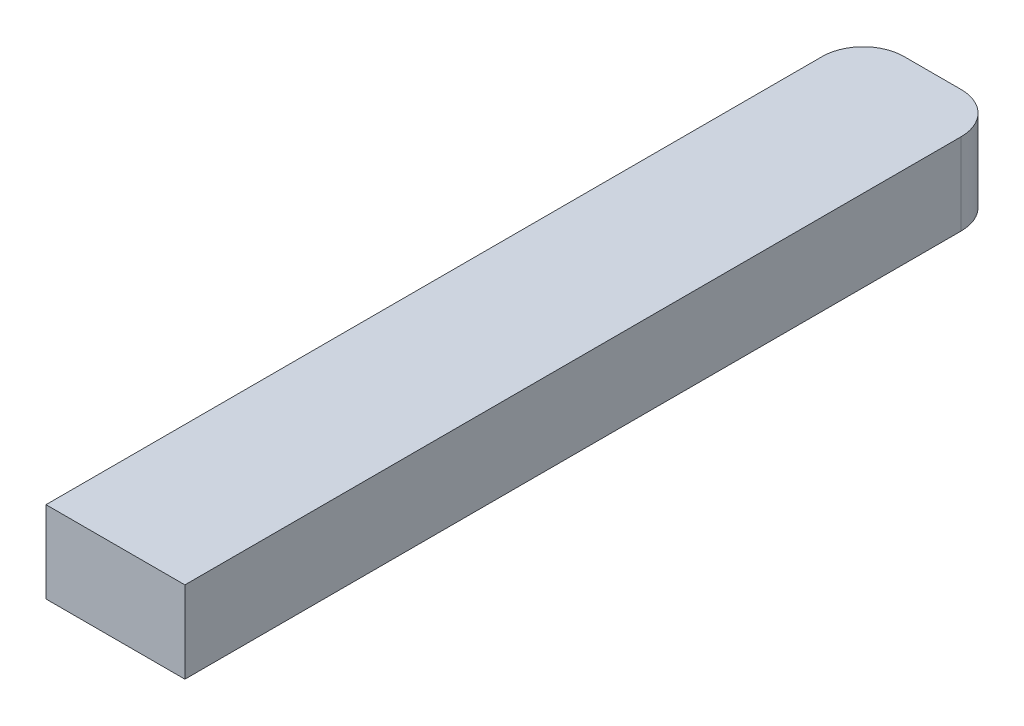
ISO-10303-21;
HEADER;
FILE_DESCRIPTION(('STEP AP214'),'2;1');
FILE_NAME('part.step','',(''),(''),'','','');
FILE_SCHEMA(('AUTOMOTIVE_DESIGN { 1 0 10303 214 1 1 1 1 }'));
ENDSEC;
DATA;
#1=APPLICATION_CONTEXT('core data for automotive mechanical design processes');
#2=APPLICATION_PROTOCOL_DEFINITION('international standard','automotive_design',2000,#1);
#3=PRODUCT_CONTEXT('',#1,'mechanical');
#4=PRODUCT('Part','Part','',(#3));
#5=PRODUCT_RELATED_PRODUCT_CATEGORY('part','',(#4));
#6=PRODUCT_DEFINITION_FORMATION('','',#4);
#7=PRODUCT_DEFINITION_CONTEXT('part definition',#1,'design');
#8=PRODUCT_DEFINITION('design','',#6,#7);
#9=PRODUCT_DEFINITION_SHAPE('','',#8);
#10=(LENGTH_UNIT() NAMED_UNIT(*) SI_UNIT(.MILLI.,.METRE.));
#11=(NAMED_UNIT(*) PLANE_ANGLE_UNIT() SI_UNIT($,.RADIAN.));
#12=(NAMED_UNIT(*) SI_UNIT($,.STERADIAN.) SOLID_ANGLE_UNIT());
#13=UNCERTAINTY_MEASURE_WITH_UNIT(LENGTH_MEASURE(1.E-05),#10,'distance_accuracy_value','');
#14=(GEOMETRIC_REPRESENTATION_CONTEXT(3) GLOBAL_UNCERTAINTY_ASSIGNED_CONTEXT((#13)) GLOBAL_UNIT_ASSIGNED_CONTEXT((#10,
#11,#12)) REPRESENTATION_CONTEXT('',''));
#15=CARTESIAN_POINT('',(0.,0.,0.));
#16=DIRECTION('',(0.,0.,1.));
#17=DIRECTION('',(1.,0.,0.));
#18=AXIS2_PLACEMENT_3D('',#15,#16,#17);
#19=CARTESIAN_POINT('',(0.175,-0.25,0.25));
#20=DIRECTION('',(0.,-1.,0.));
#21=DIRECTION('',(0.,0.,-1.));
#22=AXIS2_PLACEMENT_3D('',#19,#20,#21);
#23=CYLINDRICAL_SURFACE('',#22,0.25);
#24=CARTESIAN_POINT('',(0.175,-0.25,0.25));
#25=DIRECTION('',(0.,-1.,0.));
#26=DIRECTION('',(0.,0.,1.));
#27=AXIS2_PLACEMENT_3D('',#24,#25,#26);
#28=CIRCLE('',#27,0.25);
#29=CARTESIAN_POINT('',(0.175,-0.25,0.));
#30=VERTEX_POINT('',#29);
#31=CARTESIAN_POINT('',(0.425,-0.25,0.25));
#32=VERTEX_POINT('',#31);
#33=EDGE_CURVE('E149',#30,#32,#28,.T.);
#34=ORIENTED_EDGE('',*,*,#33,.F.);
#35=DIRECTION('',(0.,-1.,0.));
#36=VECTOR('',#35,1.);
#37=CARTESIAN_POINT('',(0.175,-0.25,0.));
#38=LINE('',#37,#36);
#39=CARTESIAN_POINT('',(0.175,0.25,0.));
#40=VERTEX_POINT('',#39);
#41=EDGE_CURVE('E11',#40,#30,#38,.T.);
#42=ORIENTED_EDGE('',*,*,#41,.F.);
#43=CARTESIAN_POINT('',(0.175,0.25,0.25));
#44=DIRECTION('',(0.,1.,0.));
#45=DIRECTION('',(0.,0.,-1.));
#46=AXIS2_PLACEMENT_3D('',#43,#44,#45);
#47=CIRCLE('',#46,0.25);
#48=CARTESIAN_POINT('',(0.425,0.25,0.25));
#49=VERTEX_POINT('',#48);
#50=EDGE_CURVE('E109',#49,#40,#47,.T.);
#51=ORIENTED_EDGE('',*,*,#50,.F.);
#52=DIRECTION('',(0.,1.,0.));
#53=VECTOR('',#52,1.);
#54=CARTESIAN_POINT('',(0.425,0.25,0.25));
#55=LINE('',#54,#53);
#56=EDGE_CURVE('E123',#32,#49,#55,.T.);
#57=ORIENTED_EDGE('',*,*,#56,.F.);
#58=EDGE_LOOP('',(#34,#42,#51,#57));
#59=FACE_BOUND('',#58,.T.);
#60=ADVANCED_FACE('F17',(#59),#23,.T.);
#61=CARTESIAN_POINT('',(-0.175,-0.25,0.25));
#62=DIRECTION('',(0.,1.,0.));
#63=DIRECTION('',(0.,0.,1.));
#64=AXIS2_PLACEMENT_3D('',#61,#62,#63);
#65=CYLINDRICAL_SURFACE('',#64,0.25);
#66=CARTESIAN_POINT('',(-0.175,0.25,0.25));
#67=DIRECTION('',(0.,1.,0.));
#68=DIRECTION('',(0.,0.,-1.));
#69=AXIS2_PLACEMENT_3D('',#66,#67,#68);
#70=CIRCLE('',#69,0.25);
#71=CARTESIAN_POINT('',(-0.175,0.25,0.));
#72=VERTEX_POINT('',#71);
#73=CARTESIAN_POINT('',(-0.425,0.25,0.25));
#74=VERTEX_POINT('',#73);
#75=EDGE_CURVE('E131',#72,#74,#70,.T.);
#76=ORIENTED_EDGE('',*,*,#75,.F.);
#77=DIRECTION('',(0.,1.,0.));
#78=VECTOR('',#77,1.);
#79=CARTESIAN_POINT('',(-0.175,0.25,0.));
#80=LINE('',#79,#78);
#81=CARTESIAN_POINT('',(-0.175,-0.25,0.));
#82=VERTEX_POINT('',#81);
#83=EDGE_CURVE('E26',#82,#72,#80,.T.);
#84=ORIENTED_EDGE('',*,*,#83,.F.);
#85=CARTESIAN_POINT('',(-0.175,-0.25,0.25));
#86=DIRECTION('',(0.,-1.,0.));
#87=DIRECTION('',(0.,0.,1.));
#88=AXIS2_PLACEMENT_3D('',#85,#86,#87);
#89=CIRCLE('',#88,0.25);
#90=CARTESIAN_POINT('',(-0.425,-0.25,0.25));
#91=VERTEX_POINT('',#90);
#92=EDGE_CURVE('E84',#91,#82,#89,.T.);
#93=ORIENTED_EDGE('',*,*,#92,.F.);
#94=DIRECTION('',(0.,-1.,0.));
#95=VECTOR('',#94,1.);
#96=CARTESIAN_POINT('',(-0.425,-0.25,0.25));
#97=LINE('',#96,#95);
#98=EDGE_CURVE('E87',#74,#91,#97,.T.);
#99=ORIENTED_EDGE('',*,*,#98,.F.);
#100=EDGE_LOOP('',(#76,#84,#93,#99));
#101=FACE_BOUND('',#100,.T.);
#102=ADVANCED_FACE('F19',(#101),#65,.T.);
#103=CARTESIAN_POINT('',(0.,0.,0.));
#104=DIRECTION('',(0.,0.,-1.));
#105=DIRECTION('',(0.,-1.,0.));
#106=AXIS2_PLACEMENT_3D('',#103,#104,#105);
#107=PLANE('',#106);
#108=DIRECTION('',(1.,0.,0.));
#109=VECTOR('',#108,1.);
#110=CARTESIAN_POINT('',(-0.425,-0.25,0.));
#111=LINE('',#110,#109);
#112=EDGE_CURVE('E92',#82,#30,#111,.T.);
#113=ORIENTED_EDGE('',*,*,#112,.F.);
#114=ORIENTED_EDGE('',*,*,#83,.T.);
#115=DIRECTION('',(-1.,0.,0.));
#116=VECTOR('',#115,1.);
#117=CARTESIAN_POINT('',(-0.425,0.25,0.));
#118=LINE('',#117,#116);
#119=EDGE_CURVE('E134',#40,#72,#118,.T.);
#120=ORIENTED_EDGE('',*,*,#119,.F.);
#121=ORIENTED_EDGE('',*,*,#41,.T.);
#122=EDGE_LOOP('',(#113,#114,#120,#121));
#123=FACE_BOUND('',#122,.T.);
#124=ADVANCED_FACE('F158',(#123),#107,.T.);
#125=CARTESIAN_POINT('',(0.,0.,5.));
#126=DIRECTION('',(0.,0.,-1.));
#127=DIRECTION('',(0.,-1.,0.));
#128=AXIS2_PLACEMENT_3D('',#125,#126,#127);
#129=PLANE('',#128);
#130=DIRECTION('',(0.,1.,0.));
#131=VECTOR('',#130,1.);
#132=CARTESIAN_POINT('',(0.425,-0.25,5.));
#133=LINE('',#132,#131);
#134=CARTESIAN_POINT('',(0.425,-0.25,5.));
#135=VERTEX_POINT('',#134);
#136=CARTESIAN_POINT('',(0.425,0.25,5.));
#137=VERTEX_POINT('',#136);
#138=EDGE_CURVE('E138',#135,#137,#133,.T.);
#139=ORIENTED_EDGE('',*,*,#138,.T.);
#140=DIRECTION('',(-1.,0.,0.));
#141=VECTOR('',#140,1.);
#142=CARTESIAN_POINT('',(-0.425,0.25,5.));
#143=LINE('',#142,#141);
#144=CARTESIAN_POINT('',(-0.425,0.25,5.));
#145=VERTEX_POINT('',#144);
#146=EDGE_CURVE('E116',#137,#145,#143,.T.);
#147=ORIENTED_EDGE('',*,*,#146,.T.);
#148=DIRECTION('',(0.,-1.,0.));
#149=VECTOR('',#148,1.);
#150=CARTESIAN_POINT('',(-0.425,-0.25,5.));
#151=LINE('',#150,#149);
#152=CARTESIAN_POINT('',(-0.425,-0.25,5.));
#153=VERTEX_POINT('',#152);
#154=EDGE_CURVE('E93',#145,#153,#151,.T.);
#155=ORIENTED_EDGE('',*,*,#154,.T.);
#156=DIRECTION('',(1.,0.,0.));
#157=VECTOR('',#156,1.);
#158=CARTESIAN_POINT('',(-0.425,-0.25,5.));
#159=LINE('',#158,#157);
#160=EDGE_CURVE('E99',#153,#135,#159,.T.);
#161=ORIENTED_EDGE('',*,*,#160,.T.);
#162=EDGE_LOOP('',(#139,#147,#155,#161));
#163=FACE_BOUND('',#162,.T.);
#164=ADVANCED_FACE('F168',(#163),#129,.F.);
#165=CARTESIAN_POINT('',(-0.425,-0.25,5.));
#166=DIRECTION('',(0.,1.,0.));
#167=DIRECTION('',(1.,0.,0.));
#168=AXIS2_PLACEMENT_3D('',#165,#166,#167);
#169=PLANE('',#168);
#170=DIRECTION('',(0.,0.,-1.));
#171=VECTOR('',#170,1.);
#172=CARTESIAN_POINT('',(-0.425,-0.25,5.));
#173=LINE('',#172,#171);
#174=EDGE_CURVE('E96',#153,#91,#173,.T.);
#175=ORIENTED_EDGE('',*,*,#174,.T.);
#176=ORIENTED_EDGE('',*,*,#92,.T.);
#177=ORIENTED_EDGE('',*,*,#112,.T.);
#178=ORIENTED_EDGE('',*,*,#33,.T.);
#179=DIRECTION('',(0.,0.,-1.));
#180=VECTOR('',#179,1.);
#181=CARTESIAN_POINT('',(0.425,-0.25,5.));
#182=LINE('',#181,#180);
#183=EDGE_CURVE('E119',#135,#32,#182,.T.);
#184=ORIENTED_EDGE('',*,*,#183,.F.);
#185=ORIENTED_EDGE('',*,*,#160,.F.);
#186=EDGE_LOOP('',(#175,#176,#177,#178,#184,#185));
#187=FACE_BOUND('',#186,.T.);
#188=ADVANCED_FACE('F97',(#187),#169,.F.);
#189=CARTESIAN_POINT('',(-0.425,-0.25,5.));
#190=DIRECTION('',(1.,0.,0.));
#191=DIRECTION('',(0.,1.,0.));
#192=AXIS2_PLACEMENT_3D('',#189,#190,#191);
#193=PLANE('',#192);
#194=DIRECTION('',(0.,0.,-1.));
#195=VECTOR('',#194,1.);
#196=CARTESIAN_POINT('',(-0.425,0.25,5.));
#197=LINE('',#196,#195);
#198=EDGE_CURVE('E106',#145,#74,#197,.T.);
#199=ORIENTED_EDGE('',*,*,#198,.T.);
#200=ORIENTED_EDGE('',*,*,#98,.T.);
#201=ORIENTED_EDGE('',*,*,#174,.F.);
#202=ORIENTED_EDGE('',*,*,#154,.F.);
#203=EDGE_LOOP('',(#199,#200,#201,#202));
#204=FACE_BOUND('',#203,.T.);
#205=ADVANCED_FACE('F104',(#204),#193,.F.);
#206=CARTESIAN_POINT('',(-0.425,0.25,5.));
#207=DIRECTION('',(0.,-1.,0.));
#208=DIRECTION('',(0.,0.,-1.));
#209=AXIS2_PLACEMENT_3D('',#206,#207,#208);
#210=PLANE('',#209);
#211=ORIENTED_EDGE('',*,*,#119,.T.);
#212=ORIENTED_EDGE('',*,*,#75,.T.);
#213=ORIENTED_EDGE('',*,*,#198,.F.);
#214=ORIENTED_EDGE('',*,*,#146,.F.);
#215=DIRECTION('',(0.,0.,-1.));
#216=VECTOR('',#215,1.);
#217=CARTESIAN_POINT('',(0.425,0.25,5.));
#218=LINE('',#217,#216);
#219=EDGE_CURVE('E130',#137,#49,#218,.T.);
#220=ORIENTED_EDGE('',*,*,#219,.T.);
#221=ORIENTED_EDGE('',*,*,#50,.T.);
#222=EDGE_LOOP('',(#211,#212,#213,#214,#220,#221));
#223=FACE_BOUND('',#222,.T.);
#224=ADVANCED_FACE('F160',(#223),#210,.F.);
#225=CARTESIAN_POINT('',(0.425,-0.25,5.));
#226=DIRECTION('',(-1.,0.,0.));
#227=DIRECTION('',(0.,0.,1.));
#228=AXIS2_PLACEMENT_3D('',#225,#226,#227);
#229=PLANE('',#228);
#230=ORIENTED_EDGE('',*,*,#183,.T.);
#231=ORIENTED_EDGE('',*,*,#56,.T.);
#232=ORIENTED_EDGE('',*,*,#219,.F.);
#233=ORIENTED_EDGE('',*,*,#138,.F.);
#234=EDGE_LOOP('',(#230,#231,#232,#233));
#235=FACE_BOUND('',#234,.T.);
#236=ADVANCED_FACE('F166',(#235),#229,.F.);
#237=CLOSED_SHELL('',(#60,#102,#124,#164,#188,#205,#224,#236));
#238=MANIFOLD_SOLID_BREP('B1',#237);
#239=ADVANCED_BREP_SHAPE_REPRESENTATION('',(#18,#238),#14);
#240=SHAPE_DEFINITION_REPRESENTATION(#9,#239);
ENDSEC;
END-ISO-10303-21;
